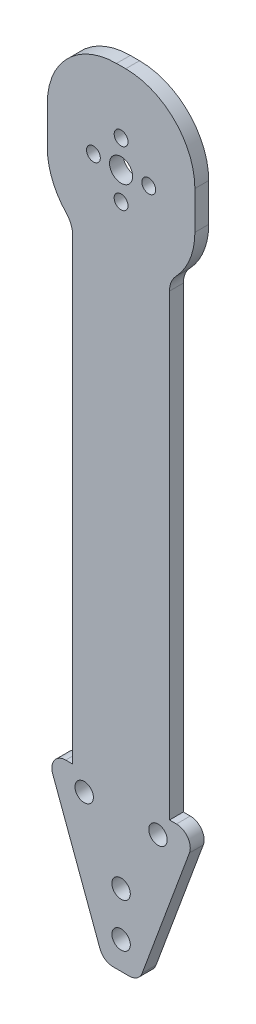
ISO-10303-21;
HEADER;
FILE_DESCRIPTION(('STEP AP214'),'2;1');
FILE_NAME('part.step','',(''),(''),'','','');
FILE_SCHEMA(('AUTOMOTIVE_DESIGN { 1 0 10303 214 1 1 1 1 }'));
ENDSEC;
DATA;
#1=APPLICATION_CONTEXT('core data for automotive mechanical design processes');
#2=APPLICATION_PROTOCOL_DEFINITION('international standard','automotive_design',2000,#1);
#3=PRODUCT_CONTEXT('',#1,'mechanical');
#4=PRODUCT('Part','Part','',(#3));
#5=PRODUCT_RELATED_PRODUCT_CATEGORY('part','',(#4));
#6=PRODUCT_DEFINITION_FORMATION('','',#4);
#7=PRODUCT_DEFINITION_CONTEXT('part definition',#1,'design');
#8=PRODUCT_DEFINITION('design','',#6,#7);
#9=PRODUCT_DEFINITION_SHAPE('','',#8);
#10=(LENGTH_UNIT() NAMED_UNIT(*) SI_UNIT(.MILLI.,.METRE.));
#11=(NAMED_UNIT(*) PLANE_ANGLE_UNIT() SI_UNIT($,.RADIAN.));
#12=(NAMED_UNIT(*) SI_UNIT($,.STERADIAN.) SOLID_ANGLE_UNIT());
#13=UNCERTAINTY_MEASURE_WITH_UNIT(LENGTH_MEASURE(1.E-05),#10,'distance_accuracy_value','');
#14=(GEOMETRIC_REPRESENTATION_CONTEXT(3) GLOBAL_UNCERTAINTY_ASSIGNED_CONTEXT((#13)) GLOBAL_UNIT_ASSIGNED_CONTEXT((#10,
#11,#12)) REPRESENTATION_CONTEXT('',''));
#15=CARTESIAN_POINT('',(0.,0.,0.));
#16=DIRECTION('',(0.,0.,1.));
#17=DIRECTION('',(1.,0.,0.));
#18=AXIS2_PLACEMENT_3D('',#15,#16,#17);
#19=CARTESIAN_POINT('',(15.5,133.,3.));
#20=DIRECTION('',(0.,0.,-1.));
#21=DIRECTION('',(-1.,0.,0.));
#22=AXIS2_PLACEMENT_3D('',#19,#20,#21);
#23=PLANE('',#22);
#24=CARTESIAN_POINT('',(0.,156.5,3.));
#25=DIRECTION('',(0.,0.,-1.));
#26=DIRECTION('',(-1.,0.,0.));
#27=AXIS2_PLACEMENT_3D('',#24,#25,#26);
#28=CIRCLE('',#27,1.5);
#29=CARTESIAN_POINT('',(-1.49999999999994,156.5,3.));
#30=VERTEX_POINT('',#29);
#31=EDGE_CURVE('E1022',#30,#30,#28,.T.);
#32=ORIENTED_EDGE('',*,*,#31,.T.);
#33=EDGE_LOOP('',(#32));
#34=FACE_BOUND('',#33,.T.);
#35=CARTESIAN_POINT('',(6.,150.5,3.));
#36=DIRECTION('',(0.,0.,-1.));
#37=DIRECTION('',(-1.,0.,0.));
#38=AXIS2_PLACEMENT_3D('',#35,#36,#37);
#39=CIRCLE('',#38,1.5);
#40=CARTESIAN_POINT('',(4.5,150.5,3.));
#41=VERTEX_POINT('',#40);
#42=EDGE_CURVE('E773',#41,#41,#39,.T.);
#43=ORIENTED_EDGE('',*,*,#42,.T.);
#44=EDGE_LOOP('',(#43));
#45=FACE_BOUND('',#44,.T.);
#46=DIRECTION('',(-1.,0.,0.));
#47=VECTOR('',#46,1.);
#48=CARTESIAN_POINT('',(12.0022720361968,33.685438564654,3.));
#49=LINE('',#48,#47);
#50=CARTESIAN_POINT('',(12.0022720361968,33.685438564654,3.));
#51=VERTEX_POINT('',#50);
#52=CARTESIAN_POINT('',(10.5,33.685438564654,3.));
#53=VERTEX_POINT('',#52);
#54=EDGE_CURVE('E822',#51,#53,#49,.T.);
#55=ORIENTED_EDGE('',*,*,#54,.T.);
#56=DIRECTION('',(0.,1.,0.));
#57=VECTOR('',#56,1.);
#58=CARTESIAN_POINT('',(10.5,33.685438564654,3.));
#59=LINE('',#58,#57);
#60=CARTESIAN_POINT('',(10.5,133.,3.));
#61=VERTEX_POINT('',#60);
#62=EDGE_CURVE('E694',#53,#61,#59,.T.);
#63=ORIENTED_EDGE('',*,*,#62,.T.);
#64=CARTESIAN_POINT('',(15.5,133.,3.));
#65=DIRECTION('',(0.,0.,-1.));
#66=DIRECTION('',(-1.,0.,0.));
#67=AXIS2_PLACEMENT_3D('',#64,#65,#66);
#68=CIRCLE('',#67,4.99999999999999);
#69=CARTESIAN_POINT('',(11.875,136.443744328489,3.));
#70=VERTEX_POINT('',#69);
#71=EDGE_CURVE('E860',#61,#70,#68,.T.);
#72=ORIENTED_EDGE('',*,*,#71,.T.);
#73=CARTESIAN_POINT('',(1.,146.774977313956,3.));
#74=DIRECTION('',(0.,0.,-1.));
#75=DIRECTION('',(-1.,0.,0.));
#76=AXIS2_PLACEMENT_3D('',#73,#74,#75);
#77=CIRCLE('',#76,15.);
#78=CARTESIAN_POINT('',(16.,146.774977313956,3.));
#79=VERTEX_POINT('',#78);
#80=EDGE_CURVE('E872',#79,#70,#77,.T.);
#81=ORIENTED_EDGE('',*,*,#80,.F.);
#82=DIRECTION('',(0.,1.,0.));
#83=VECTOR('',#82,1.);
#84=CARTESIAN_POINT('',(16.,146.774977313956,3.));
#85=LINE('',#84,#83);
#86=CARTESIAN_POINT('',(16.,155.,3.));
#87=VERTEX_POINT('',#86);
#88=EDGE_CURVE('E873',#79,#87,#85,.T.);
#89=ORIENTED_EDGE('',*,*,#88,.T.);
#90=CARTESIAN_POINT('',(1.,155.,3.));
#91=DIRECTION('',(0.,0.,-1.));
#92=DIRECTION('',(-1.,0.,0.));
#93=AXIS2_PLACEMENT_3D('',#90,#91,#92);
#94=CIRCLE('',#93,15.);
#95=CARTESIAN_POINT('',(0.999999999999895,170.,3.));
#96=VERTEX_POINT('',#95);
#97=EDGE_CURVE('E875',#96,#87,#94,.T.);
#98=ORIENTED_EDGE('',*,*,#97,.F.);
#99=DIRECTION('',(1.,0.,0.));
#100=VECTOR('',#99,1.);
#101=CARTESIAN_POINT('',(-0.999999999999895,170.,3.));
#102=LINE('',#101,#100);
#103=CARTESIAN_POINT('',(-0.999999999999895,170.,3.));
#104=VERTEX_POINT('',#103);
#105=EDGE_CURVE('E882',#104,#96,#102,.T.);
#106=ORIENTED_EDGE('',*,*,#105,.F.);
#107=CARTESIAN_POINT('',(-1.,155.,3.));
#108=DIRECTION('',(0.,0.,-1.));
#109=DIRECTION('',(-1.,0.,0.));
#110=AXIS2_PLACEMENT_3D('',#107,#108,#109);
#111=CIRCLE('',#110,15.);
#112=CARTESIAN_POINT('',(-16.,155.,3.));
#113=VERTEX_POINT('',#112);
#114=EDGE_CURVE('E885',#113,#104,#111,.T.);
#115=ORIENTED_EDGE('',*,*,#114,.F.);
#116=DIRECTION('',(0.,1.,0.));
#117=VECTOR('',#116,1.);
#118=CARTESIAN_POINT('',(-16.,146.774977313956,3.));
#119=LINE('',#118,#117);
#120=CARTESIAN_POINT('',(-16.,146.774977313956,3.));
#121=VERTEX_POINT('',#120);
#122=EDGE_CURVE('E888',#121,#113,#119,.T.);
#123=ORIENTED_EDGE('',*,*,#122,.F.);
#124=CARTESIAN_POINT('',(-1.,146.774977313956,3.));
#125=DIRECTION('',(0.,0.,1.));
#126=DIRECTION('',(1.,0.,0.));
#127=AXIS2_PLACEMENT_3D('',#124,#125,#126);
#128=CIRCLE('',#127,15.);
#129=CARTESIAN_POINT('',(-11.875,136.443744328489,3.));
#130=VERTEX_POINT('',#129);
#131=EDGE_CURVE('E891',#121,#130,#128,.T.);
#132=ORIENTED_EDGE('',*,*,#131,.T.);
#133=CARTESIAN_POINT('',(-15.5,133.,3.));
#134=DIRECTION('',(0.,0.,-1.));
#135=DIRECTION('',(-1.,0.,0.));
#136=AXIS2_PLACEMENT_3D('',#133,#134,#135);
#137=CIRCLE('',#136,5.);
#138=CARTESIAN_POINT('',(-10.5,133.,3.));
#139=VERTEX_POINT('',#138);
#140=EDGE_CURVE('E893',#130,#139,#137,.T.);
#141=ORIENTED_EDGE('',*,*,#140,.T.);
#142=DIRECTION('',(0.,1.,0.));
#143=VECTOR('',#142,1.);
#144=CARTESIAN_POINT('',(-10.5,33.685438564654,3.));
#145=LINE('',#144,#143);
#146=CARTESIAN_POINT('',(-10.5,33.685438564654,3.));
#147=VERTEX_POINT('',#146);
#148=EDGE_CURVE('E895',#147,#139,#145,.T.);
#149=ORIENTED_EDGE('',*,*,#148,.F.);
#150=DIRECTION('',(1.,0.,0.));
#151=VECTOR('',#150,1.);
#152=CARTESIAN_POINT('',(-12.0022720361968,33.685438564654,3.));
#153=LINE('',#152,#151);
#154=CARTESIAN_POINT('',(-12.0022720361968,33.685438564654,3.));
#155=VERTEX_POINT('',#154);
#156=EDGE_CURVE('E898',#155,#147,#153,.T.);
#157=ORIENTED_EDGE('',*,*,#156,.F.);
#158=CARTESIAN_POINT('',(-12.0022720361968,30.685438564654,3.));
#159=DIRECTION('',(0.,0.,-1.));
#160=DIRECTION('',(-1.,0.,0.));
#161=AXIS2_PLACEMENT_3D('',#158,#159,#160);
#162=CIRCLE('',#161,3.);
#163=CARTESIAN_POINT('',(-14.8159863239344,29.6447599846009,3.));
#164=VERTEX_POINT('',#163);
#165=EDGE_CURVE('E901',#164,#155,#162,.T.);
#166=ORIENTED_EDGE('',*,*,#165,.F.);
#167=DIRECTION('',(-0.346892860017721,0.937904762579189,0.));
#168=VECTOR('',#167,1.);
#169=CARTESIAN_POINT('',(-4.57626759372177,1.95932141994684,3.));
#170=LINE('',#169,#168);
#171=CARTESIAN_POINT('',(-4.57626759372177,1.95932141994684,3.));
#172=VERTEX_POINT('',#171);
#173=EDGE_CURVE('E904',#172,#164,#170,.T.);
#174=ORIENTED_EDGE('',*,*,#173,.F.);
#175=CARTESIAN_POINT('',(-1.7625533059842,3.,3.));
#176=DIRECTION('',(0.,0.,1.));
#177=DIRECTION('',(1.,0.,0.));
#178=AXIS2_PLACEMENT_3D('',#175,#176,#177);
#179=CIRCLE('',#178,3.);
#180=CARTESIAN_POINT('',(-1.7625533059842,0.,3.));
#181=VERTEX_POINT('',#180);
#182=EDGE_CURVE('E763',#172,#181,#179,.T.);
#183=ORIENTED_EDGE('',*,*,#182,.T.);
#184=DIRECTION('',(-1.,0.,0.));
#185=VECTOR('',#184,1.);
#186=CARTESIAN_POINT('',(1.7625533059842,0.,3.));
#187=LINE('',#186,#185);
#188=CARTESIAN_POINT('',(1.7625533059842,0.,3.));
#189=VERTEX_POINT('',#188);
#190=EDGE_CURVE('E761',#189,#181,#187,.T.);
#191=ORIENTED_EDGE('',*,*,#190,.F.);
#192=CARTESIAN_POINT('',(1.7625533059842,3.,3.));
#193=DIRECTION('',(0.,0.,-1.));
#194=DIRECTION('',(-1.,0.,0.));
#195=AXIS2_PLACEMENT_3D('',#192,#193,#194);
#196=CIRCLE('',#195,3.);
#197=CARTESIAN_POINT('',(4.57626759372177,1.95932141994684,3.));
#198=VERTEX_POINT('',#197);
#199=EDGE_CURVE('E749',#198,#189,#196,.T.);
#200=ORIENTED_EDGE('',*,*,#199,.F.);
#201=DIRECTION('',(0.346892860017721,0.937904762579189,0.));
#202=VECTOR('',#201,1.);
#203=CARTESIAN_POINT('',(4.57626759372177,1.95932141994684,3.));
#204=LINE('',#203,#202);
#205=CARTESIAN_POINT('',(14.8159863239344,29.6447599846009,3.));
#206=VERTEX_POINT('',#205);
#207=EDGE_CURVE('E755',#198,#206,#204,.T.);
#208=ORIENTED_EDGE('',*,*,#207,.T.);
#209=CARTESIAN_POINT('',(12.0022720361968,30.685438564654,3.));
#210=DIRECTION('',(0.,0.,1.));
#211=DIRECTION('',(1.,0.,0.));
#212=AXIS2_PLACEMENT_3D('',#209,#210,#211);
#213=CIRCLE('',#212,3.);
#214=EDGE_CURVE('E616',#206,#51,#213,.T.);
#215=ORIENTED_EDGE('',*,*,#214,.T.);
#216=EDGE_LOOP('',(#55,#63,#72,#81,#89,#98,#106,#115,#123,#132,#141,#149,#157,#166,#174,#183,
#191,#200,#208,#215));
#217=FACE_BOUND('',#216,.T.);
#218=CARTESIAN_POINT('',(-6.,150.5,3.));
#219=DIRECTION('',(0.,0.,1.));
#220=DIRECTION('',(1.,0.,0.));
#221=AXIS2_PLACEMENT_3D('',#218,#219,#220);
#222=CIRCLE('',#221,1.5);
#223=CARTESIAN_POINT('',(-4.5,150.5,3.));
#224=VERTEX_POINT('',#223);
#225=EDGE_CURVE('E1016',#224,#224,#222,.T.);
#226=ORIENTED_EDGE('',*,*,#225,.F.);
#227=EDGE_LOOP('',(#226));
#228=FACE_BOUND('',#227,.T.);
#229=CARTESIAN_POINT('',(0.,144.5,3.));
#230=DIRECTION('',(0.,0.,1.));
#231=DIRECTION('',(1.,0.,0.));
#232=AXIS2_PLACEMENT_3D('',#229,#230,#231);
#233=CIRCLE('',#232,1.5);
#234=CARTESIAN_POINT('',(1.5,144.5,3.));
#235=VERTEX_POINT('',#234);
#236=EDGE_CURVE('E1010',#235,#235,#233,.T.);
#237=ORIENTED_EDGE('',*,*,#236,.F.);
#238=EDGE_LOOP('',(#237));
#239=FACE_BOUND('',#238,.T.);
#240=CARTESIAN_POINT('',(0.,6.,3.));
#241=DIRECTION('',(0.,0.,1.));
#242=DIRECTION('',(1.,0.,0.));
#243=AXIS2_PLACEMENT_3D('',#240,#241,#242);
#244=CIRCLE('',#243,2.);
#245=CARTESIAN_POINT('',(2.,6.,3.));
#246=VERTEX_POINT('',#245);
#247=EDGE_CURVE('E1004',#246,#246,#244,.T.);
#248=ORIENTED_EDGE('',*,*,#247,.F.);
#249=EDGE_LOOP('',(#248));
#250=FACE_BOUND('',#249,.T.);
#251=CARTESIAN_POINT('',(0.,15.55,3.));
#252=DIRECTION('',(0.,0.,1.));
#253=DIRECTION('',(1.,0.,0.));
#254=AXIS2_PLACEMENT_3D('',#251,#252,#253);
#255=CIRCLE('',#254,2.);
#256=CARTESIAN_POINT('',(2.,15.55,3.));
#257=VERTEX_POINT('',#256);
#258=EDGE_CURVE('E998',#257,#257,#255,.T.);
#259=ORIENTED_EDGE('',*,*,#258,.F.);
#260=EDGE_LOOP('',(#259));
#261=FACE_BOUND('',#260,.T.);
#262=CARTESIAN_POINT('',(-8.00000000000001,29.685438564654,3.));
#263=DIRECTION('',(0.,0.,1.));
#264=DIRECTION('',(1.,0.,0.));
#265=AXIS2_PLACEMENT_3D('',#262,#263,#264);
#266=CIRCLE('',#265,2.);
#267=CARTESIAN_POINT('',(-6.,29.685438564654,3.));
#268=VERTEX_POINT('',#267);
#269=EDGE_CURVE('E992',#268,#268,#266,.T.);
#270=ORIENTED_EDGE('',*,*,#269,.F.);
#271=EDGE_LOOP('',(#270));
#272=FACE_BOUND('',#271,.T.);
#273=CARTESIAN_POINT('',(7.99999999999999,29.685438564654,3.));
#274=DIRECTION('',(0.,0.,1.));
#275=DIRECTION('',(1.,0.,0.));
#276=AXIS2_PLACEMENT_3D('',#273,#274,#275);
#277=CIRCLE('',#276,2.);
#278=CARTESIAN_POINT('',(9.99999999999999,29.685438564654,3.));
#279=VERTEX_POINT('',#278);
#280=EDGE_CURVE('E986',#279,#279,#277,.T.);
#281=ORIENTED_EDGE('',*,*,#280,.F.);
#282=EDGE_LOOP('',(#281));
#283=FACE_BOUND('',#282,.T.);
#284=CARTESIAN_POINT('',(0.,150.5,3.));
#285=DIRECTION('',(0.,0.,1.));
#286=DIRECTION('',(1.,0.,0.));
#287=AXIS2_PLACEMENT_3D('',#284,#285,#286);
#288=CIRCLE('',#287,2.5);
#289=CARTESIAN_POINT('',(2.5,150.5,3.));
#290=VERTEX_POINT('',#289);
#291=EDGE_CURVE('E977',#290,#290,#288,.T.);
#292=ORIENTED_EDGE('',*,*,#291,.F.);
#293=EDGE_LOOP('',(#292));
#294=FACE_BOUND('',#293,.T.);
#295=ADVANCED_FACE('F599',(#34,#45,#217,#228,#239,#250,#261,#272,#283,#294),#23,.F.);
#296=CARTESIAN_POINT('',(15.5,133.,0.));
#297=DIRECTION('',(0.,0.,-1.));
#298=DIRECTION('',(-1.,0.,0.));
#299=AXIS2_PLACEMENT_3D('',#296,#297,#298);
#300=PLANE('',#299);
#301=CARTESIAN_POINT('',(7.99999999999999,29.685438564654,0.));
#302=DIRECTION('',(0.,0.,1.));
#303=DIRECTION('',(1.,0.,0.));
#304=AXIS2_PLACEMENT_3D('',#301,#302,#303);
#305=CIRCLE('',#304,2.);
#306=CARTESIAN_POINT('',(9.99999999999999,29.685438564654,0.));
#307=VERTEX_POINT('',#306);
#308=EDGE_CURVE('E983',#307,#307,#305,.T.);
#309=ORIENTED_EDGE('',*,*,#308,.T.);
#310=EDGE_LOOP('',(#309));
#311=FACE_BOUND('',#310,.T.);
#312=CARTESIAN_POINT('',(0.,15.55,0.));
#313=DIRECTION('',(0.,0.,1.));
#314=DIRECTION('',(1.,0.,0.));
#315=AXIS2_PLACEMENT_3D('',#312,#313,#314);
#316=CIRCLE('',#315,2.);
#317=CARTESIAN_POINT('',(2.,15.55,0.));
#318=VERTEX_POINT('',#317);
#319=EDGE_CURVE('E995',#318,#318,#316,.T.);
#320=ORIENTED_EDGE('',*,*,#319,.T.);
#321=EDGE_LOOP('',(#320));
#322=FACE_BOUND('',#321,.T.);
#323=CARTESIAN_POINT('',(0.,144.5,0.));
#324=DIRECTION('',(0.,0.,1.));
#325=DIRECTION('',(1.,0.,0.));
#326=AXIS2_PLACEMENT_3D('',#323,#324,#325);
#327=CIRCLE('',#326,1.5);
#328=CARTESIAN_POINT('',(1.5,144.5,0.));
#329=VERTEX_POINT('',#328);
#330=EDGE_CURVE('E1007',#329,#329,#327,.T.);
#331=ORIENTED_EDGE('',*,*,#330,.T.);
#332=EDGE_LOOP('',(#331));
#333=FACE_BOUND('',#332,.T.);
#334=DIRECTION('',(-1.,0.,0.));
#335=VECTOR('',#334,1.);
#336=CARTESIAN_POINT('',(12.0022720361968,33.685438564654,0.));
#337=LINE('',#336,#335);
#338=CARTESIAN_POINT('',(12.0022720361968,33.685438564654,0.));
#339=VERTEX_POINT('',#338);
#340=CARTESIAN_POINT('',(10.5,33.685438564654,0.));
#341=VERTEX_POINT('',#340);
#342=EDGE_CURVE('E769',#339,#341,#337,.T.);
#343=ORIENTED_EDGE('',*,*,#342,.F.);
#344=CARTESIAN_POINT('',(12.0022720361968,30.685438564654,0.));
#345=DIRECTION('',(0.,0.,1.));
#346=DIRECTION('',(1.,0.,0.));
#347=AXIS2_PLACEMENT_3D('',#344,#345,#346);
#348=CIRCLE('',#347,3.);
#349=CARTESIAN_POINT('',(14.8159863239344,29.6447599846009,0.));
#350=VERTEX_POINT('',#349);
#351=EDGE_CURVE('E686',#350,#339,#348,.T.);
#352=ORIENTED_EDGE('',*,*,#351,.F.);
#353=DIRECTION('',(0.346892860017721,0.937904762579189,0.));
#354=VECTOR('',#353,1.);
#355=CARTESIAN_POINT('',(4.57626759372177,1.95932141994684,0.));
#356=LINE('',#355,#354);
#357=CARTESIAN_POINT('',(4.57626759372177,1.95932141994684,0.));
#358=VERTEX_POINT('',#357);
#359=EDGE_CURVE('E680',#358,#350,#356,.T.);
#360=ORIENTED_EDGE('',*,*,#359,.F.);
#361=CARTESIAN_POINT('',(1.7625533059842,3.,0.));
#362=DIRECTION('',(0.,0.,-1.));
#363=DIRECTION('',(-1.,0.,0.));
#364=AXIS2_PLACEMENT_3D('',#361,#362,#363);
#365=CIRCLE('',#364,3.);
#366=CARTESIAN_POINT('',(1.7625533059842,0.,0.));
#367=VERTEX_POINT('',#366);
#368=EDGE_CURVE('E751',#358,#367,#365,.T.);
#369=ORIENTED_EDGE('',*,*,#368,.T.);
#370=DIRECTION('',(-1.,0.,0.));
#371=VECTOR('',#370,1.);
#372=CARTESIAN_POINT('',(1.7625533059842,0.,0.));
#373=LINE('',#372,#371);
#374=CARTESIAN_POINT('',(-1.7625533059842,0.,0.));
#375=VERTEX_POINT('',#374);
#376=EDGE_CURVE('E816',#367,#375,#373,.T.);
#377=ORIENTED_EDGE('',*,*,#376,.T.);
#378=CARTESIAN_POINT('',(-1.7625533059842,3.,0.));
#379=DIRECTION('',(0.,0.,1.));
#380=DIRECTION('',(1.,0.,0.));
#381=AXIS2_PLACEMENT_3D('',#378,#379,#380);
#382=CIRCLE('',#381,3.);
#383=CARTESIAN_POINT('',(-4.57626759372177,1.95932141994684,0.));
#384=VERTEX_POINT('',#383);
#385=EDGE_CURVE('E813',#384,#375,#382,.T.);
#386=ORIENTED_EDGE('',*,*,#385,.F.);
#387=DIRECTION('',(-0.346892860017721,0.937904762579189,0.));
#388=VECTOR('',#387,1.);
#389=CARTESIAN_POINT('',(-4.57626759372177,1.95932141994684,0.));
#390=LINE('',#389,#388);
#391=CARTESIAN_POINT('',(-14.8159863239344,29.6447599846009,0.));
#392=VERTEX_POINT('',#391);
#393=EDGE_CURVE('E810',#384,#392,#390,.T.);
#394=ORIENTED_EDGE('',*,*,#393,.T.);
#395=CARTESIAN_POINT('',(-12.0022720361968,30.685438564654,0.));
#396=DIRECTION('',(0.,0.,-1.));
#397=DIRECTION('',(-1.,0.,0.));
#398=AXIS2_PLACEMENT_3D('',#395,#396,#397);
#399=CIRCLE('',#398,3.);
#400=CARTESIAN_POINT('',(-12.0022720361968,33.685438564654,0.));
#401=VERTEX_POINT('',#400);
#402=EDGE_CURVE('E807',#392,#401,#399,.T.);
#403=ORIENTED_EDGE('',*,*,#402,.T.);
#404=DIRECTION('',(1.,0.,0.));
#405=VECTOR('',#404,1.);
#406=CARTESIAN_POINT('',(-12.0022720361968,33.685438564654,0.));
#407=LINE('',#406,#405);
#408=CARTESIAN_POINT('',(-10.5,33.685438564654,0.));
#409=VERTEX_POINT('',#408);
#410=EDGE_CURVE('E804',#401,#409,#407,.T.);
#411=ORIENTED_EDGE('',*,*,#410,.T.);
#412=DIRECTION('',(0.,1.,0.));
#413=VECTOR('',#412,1.);
#414=CARTESIAN_POINT('',(-10.5,33.685438564654,0.));
#415=LINE('',#414,#413);
#416=CARTESIAN_POINT('',(-10.5,133.,0.));
#417=VERTEX_POINT('',#416);
#418=EDGE_CURVE('E801',#409,#417,#415,.T.);
#419=ORIENTED_EDGE('',*,*,#418,.T.);
#420=CARTESIAN_POINT('',(-15.5,133.,0.));
#421=DIRECTION('',(0.,0.,-1.));
#422=DIRECTION('',(-1.,0.,0.));
#423=AXIS2_PLACEMENT_3D('',#420,#421,#422);
#424=CIRCLE('',#423,5.);
#425=CARTESIAN_POINT('',(-11.875,136.443744328489,0.));
#426=VERTEX_POINT('',#425);
#427=EDGE_CURVE('E798',#426,#417,#424,.T.);
#428=ORIENTED_EDGE('',*,*,#427,.F.);
#429=CARTESIAN_POINT('',(-1.,146.774977313956,0.));
#430=DIRECTION('',(0.,0.,1.));
#431=DIRECTION('',(1.,0.,0.));
#432=AXIS2_PLACEMENT_3D('',#429,#430,#431);
#433=CIRCLE('',#432,15.);
#434=CARTESIAN_POINT('',(-16.,146.774977313956,0.));
#435=VERTEX_POINT('',#434);
#436=EDGE_CURVE('E796',#435,#426,#433,.T.);
#437=ORIENTED_EDGE('',*,*,#436,.F.);
#438=DIRECTION('',(0.,1.,0.));
#439=VECTOR('',#438,1.);
#440=CARTESIAN_POINT('',(-16.,146.774977313956,0.));
#441=LINE('',#440,#439);
#442=CARTESIAN_POINT('',(-16.,155.,0.));
#443=VERTEX_POINT('',#442);
#444=EDGE_CURVE('E793',#435,#443,#441,.T.);
#445=ORIENTED_EDGE('',*,*,#444,.T.);
#446=CARTESIAN_POINT('',(-1.,155.,0.));
#447=DIRECTION('',(0.,0.,-1.));
#448=DIRECTION('',(-1.,0.,0.));
#449=AXIS2_PLACEMENT_3D('',#446,#447,#448);
#450=CIRCLE('',#449,15.);
#451=CARTESIAN_POINT('',(-0.999999999999895,170.,0.));
#452=VERTEX_POINT('',#451);
#453=EDGE_CURVE('E790',#443,#452,#450,.T.);
#454=ORIENTED_EDGE('',*,*,#453,.T.);
#455=DIRECTION('',(1.,0.,0.));
#456=VECTOR('',#455,1.);
#457=CARTESIAN_POINT('',(-0.999999999999895,170.,0.));
#458=LINE('',#457,#456);
#459=CARTESIAN_POINT('',(0.999999999999895,170.,0.));
#460=VERTEX_POINT('',#459);
#461=EDGE_CURVE('E787',#452,#460,#458,.T.);
#462=ORIENTED_EDGE('',*,*,#461,.T.);
#463=CARTESIAN_POINT('',(1.,155.,0.));
#464=DIRECTION('',(0.,0.,-1.));
#465=DIRECTION('',(-1.,0.,0.));
#466=AXIS2_PLACEMENT_3D('',#463,#464,#465);
#467=CIRCLE('',#466,15.);
#468=CARTESIAN_POINT('',(16.,155.,0.));
#469=VERTEX_POINT('',#468);
#470=EDGE_CURVE('E784',#460,#469,#467,.T.);
#471=ORIENTED_EDGE('',*,*,#470,.T.);
#472=DIRECTION('',(0.,1.,0.));
#473=VECTOR('',#472,1.);
#474=CARTESIAN_POINT('',(16.,146.774977313956,0.));
#475=LINE('',#474,#473);
#476=CARTESIAN_POINT('',(16.,146.774977313956,0.));
#477=VERTEX_POINT('',#476);
#478=EDGE_CURVE('E781',#477,#469,#475,.T.);
#479=ORIENTED_EDGE('',*,*,#478,.F.);
#480=CARTESIAN_POINT('',(1.,146.774977313956,0.));
#481=DIRECTION('',(0.,0.,-1.));
#482=DIRECTION('',(-1.,0.,0.));
#483=AXIS2_PLACEMENT_3D('',#480,#481,#482);
#484=CIRCLE('',#483,15.);
#485=CARTESIAN_POINT('',(11.875,136.443744328489,0.));
#486=VERTEX_POINT('',#485);
#487=EDGE_CURVE('E778',#477,#486,#484,.T.);
#488=ORIENTED_EDGE('',*,*,#487,.T.);
#489=CARTESIAN_POINT('',(15.5,133.,0.));
#490=DIRECTION('',(0.,0.,-1.));
#491=DIRECTION('',(-1.,0.,0.));
#492=AXIS2_PLACEMENT_3D('',#489,#490,#491);
#493=CIRCLE('',#492,4.99999999999999);
#494=CARTESIAN_POINT('',(10.5,133.,0.));
#495=VERTEX_POINT('',#494);
#496=EDGE_CURVE('E775',#495,#486,#493,.T.);
#497=ORIENTED_EDGE('',*,*,#496,.F.);
#498=DIRECTION('',(0.,1.,0.));
#499=VECTOR('',#498,1.);
#500=CARTESIAN_POINT('',(10.5,33.685438564654,0.));
#501=LINE('',#500,#499);
#502=EDGE_CURVE('E772',#341,#495,#501,.T.);
#503=ORIENTED_EDGE('',*,*,#502,.F.);
#504=EDGE_LOOP('',(#343,#352,#360,#369,#377,#386,#394,#403,#411,#419,#428,#437,#445,#454,#462,
#471,#479,#488,#497,#503));
#505=FACE_BOUND('',#504,.T.);
#506=CARTESIAN_POINT('',(6.,150.5,0.));
#507=DIRECTION('',(0.,0.,-1.));
#508=DIRECTION('',(-1.,0.,0.));
#509=AXIS2_PLACEMENT_3D('',#506,#507,#508);
#510=CIRCLE('',#509,1.5);
#511=CARTESIAN_POINT('',(4.5,150.5,0.));
#512=VERTEX_POINT('',#511);
#513=EDGE_CURVE('E1024',#512,#512,#510,.T.);
#514=ORIENTED_EDGE('',*,*,#513,.F.);
#515=EDGE_LOOP('',(#514));
#516=FACE_BOUND('',#515,.T.);
#517=CARTESIAN_POINT('',(0.,156.5,0.));
#518=DIRECTION('',(0.,0.,-1.));
#519=DIRECTION('',(-1.,0.,0.));
#520=AXIS2_PLACEMENT_3D('',#517,#518,#519);
#521=CIRCLE('',#520,1.5);
#522=CARTESIAN_POINT('',(-1.49999999999994,156.5,0.));
#523=VERTEX_POINT('',#522);
#524=EDGE_CURVE('E1019',#523,#523,#521,.T.);
#525=ORIENTED_EDGE('',*,*,#524,.F.);
#526=EDGE_LOOP('',(#525));
#527=FACE_BOUND('',#526,.T.);
#528=CARTESIAN_POINT('',(-6.,150.5,0.));
#529=DIRECTION('',(0.,0.,1.));
#530=DIRECTION('',(1.,0.,0.));
#531=AXIS2_PLACEMENT_3D('',#528,#529,#530);
#532=CIRCLE('',#531,1.5);
#533=CARTESIAN_POINT('',(-4.5,150.5,0.));
#534=VERTEX_POINT('',#533);
#535=EDGE_CURVE('E1013',#534,#534,#532,.T.);
#536=ORIENTED_EDGE('',*,*,#535,.T.);
#537=EDGE_LOOP('',(#536));
#538=FACE_BOUND('',#537,.T.);
#539=CARTESIAN_POINT('',(0.,6.,0.));
#540=DIRECTION('',(0.,0.,1.));
#541=DIRECTION('',(1.,0.,0.));
#542=AXIS2_PLACEMENT_3D('',#539,#540,#541);
#543=CIRCLE('',#542,2.);
#544=CARTESIAN_POINT('',(2.,6.,0.));
#545=VERTEX_POINT('',#544);
#546=EDGE_CURVE('E1001',#545,#545,#543,.T.);
#547=ORIENTED_EDGE('',*,*,#546,.T.);
#548=EDGE_LOOP('',(#547));
#549=FACE_BOUND('',#548,.T.);
#550=CARTESIAN_POINT('',(-8.00000000000001,29.685438564654,0.));
#551=DIRECTION('',(0.,0.,1.));
#552=DIRECTION('',(1.,0.,0.));
#553=AXIS2_PLACEMENT_3D('',#550,#551,#552);
#554=CIRCLE('',#553,2.);
#555=CARTESIAN_POINT('',(-6.,29.685438564654,0.));
#556=VERTEX_POINT('',#555);
#557=EDGE_CURVE('E989',#556,#556,#554,.T.);
#558=ORIENTED_EDGE('',*,*,#557,.T.);
#559=EDGE_LOOP('',(#558));
#560=FACE_BOUND('',#559,.T.);
#561=CARTESIAN_POINT('',(0.,150.5,0.));
#562=DIRECTION('',(0.,0.,1.));
#563=DIRECTION('',(1.,0.,0.));
#564=AXIS2_PLACEMENT_3D('',#561,#562,#563);
#565=CIRCLE('',#564,2.5);
#566=CARTESIAN_POINT('',(2.5,150.5,0.));
#567=VERTEX_POINT('',#566);
#568=EDGE_CURVE('E980',#567,#567,#565,.T.);
#569=ORIENTED_EDGE('',*,*,#568,.T.);
#570=EDGE_LOOP('',(#569));
#571=FACE_BOUND('',#570,.T.);
#572=ADVANCED_FACE('F863',(#311,#322,#333,#505,#516,#527,#538,#549,#560,#571),#300,.T.);
#573=CARTESIAN_POINT('',(12.0022720361968,33.685438564654,3.));
#574=DIRECTION('',(0.,-1.,0.));
#575=DIRECTION('',(0.,0.,-1.));
#576=AXIS2_PLACEMENT_3D('',#573,#574,#575);
#577=PLANE('',#576);
#578=ORIENTED_EDGE('',*,*,#342,.T.);
#579=DIRECTION('',(0.,0.,-1.));
#580=VECTOR('',#579,1.);
#581=CARTESIAN_POINT('',(10.5,33.685438564654,3.));
#582=LINE('',#581,#580);
#583=EDGE_CURVE('E12',#53,#341,#582,.T.);
#584=ORIENTED_EDGE('',*,*,#583,.F.);
#585=ORIENTED_EDGE('',*,*,#54,.F.);
#586=DIRECTION('',(0.,0.,-1.));
#587=VECTOR('',#586,1.);
#588=CARTESIAN_POINT('',(12.0022720361968,33.685438564654,3.));
#589=LINE('',#588,#587);
#590=EDGE_CURVE('E768',#51,#339,#589,.T.);
#591=ORIENTED_EDGE('',*,*,#590,.T.);
#592=EDGE_LOOP('',(#578,#584,#585,#591));
#593=FACE_BOUND('',#592,.T.);
#594=ADVANCED_FACE('F601',(#593),#577,.F.);
#595=CARTESIAN_POINT('',(10.5,33.685438564654,3.));
#596=DIRECTION('',(-1.,0.,0.));
#597=DIRECTION('',(0.,-1.,0.));
#598=AXIS2_PLACEMENT_3D('',#595,#596,#597);
#599=PLANE('',#598);
#600=ORIENTED_EDGE('',*,*,#502,.T.);
#601=DIRECTION('',(0.,0.,-1.));
#602=VECTOR('',#601,1.);
#603=CARTESIAN_POINT('',(10.5,133.,3.));
#604=LINE('',#603,#602);
#605=EDGE_CURVE('E608',#61,#495,#604,.T.);
#606=ORIENTED_EDGE('',*,*,#605,.F.);
#607=ORIENTED_EDGE('',*,*,#62,.F.);
#608=ORIENTED_EDGE('',*,*,#583,.T.);
#609=EDGE_LOOP('',(#600,#606,#607,#608));
#610=FACE_BOUND('',#609,.T.);
#611=ADVANCED_FACE('F1260',(#610),#599,.F.);
#612=CARTESIAN_POINT('',(15.5,133.,3.));
#613=DIRECTION('',(0.,0.,-1.));
#614=DIRECTION('',(-1.,0.,0.));
#615=AXIS2_PLACEMENT_3D('',#612,#613,#614);
#616=CYLINDRICAL_SURFACE('',#615,4.99999999999999);
#617=ORIENTED_EDGE('',*,*,#496,.T.);
#618=DIRECTION('',(0.,0.,-1.));
#619=VECTOR('',#618,1.);
#620=CARTESIAN_POINT('',(11.875,136.443744328489,3.));
#621=LINE('',#620,#619);
#622=EDGE_CURVE('E853',#70,#486,#621,.T.);
#623=ORIENTED_EDGE('',*,*,#622,.F.);
#624=ORIENTED_EDGE('',*,*,#71,.F.);
#625=ORIENTED_EDGE('',*,*,#605,.T.);
#626=EDGE_LOOP('',(#617,#623,#624,#625));
#627=FACE_BOUND('',#626,.T.);
#628=ADVANCED_FACE('F858',(#627),#616,.F.);
#629=CARTESIAN_POINT('',(1.,146.774977313956,3.));
#630=DIRECTION('',(0.,0.,-1.));
#631=DIRECTION('',(-1.,0.,0.));
#632=AXIS2_PLACEMENT_3D('',#629,#630,#631);
#633=CYLINDRICAL_SURFACE('',#632,15.);
#634=ORIENTED_EDGE('',*,*,#487,.F.);
#635=DIRECTION('',(0.,0.,-1.));
#636=VECTOR('',#635,1.);
#637=CARTESIAN_POINT('',(16.,146.774977313956,3.));
#638=LINE('',#637,#636);
#639=EDGE_CURVE('E851',#79,#477,#638,.T.);
#640=ORIENTED_EDGE('',*,*,#639,.F.);
#641=ORIENTED_EDGE('',*,*,#80,.T.);
#642=ORIENTED_EDGE('',*,*,#622,.T.);
#643=EDGE_LOOP('',(#634,#640,#641,#642));
#644=FACE_BOUND('',#643,.T.);
#645=ADVANCED_FACE('F868',(#644),#633,.T.);
#646=CARTESIAN_POINT('',(16.,146.774977313956,3.));
#647=DIRECTION('',(-1.,0.,0.));
#648=DIRECTION('',(0.,0.,1.));
#649=AXIS2_PLACEMENT_3D('',#646,#647,#648);
#650=PLANE('',#649);
#651=ORIENTED_EDGE('',*,*,#478,.T.);
#652=DIRECTION('',(0.,0.,-1.));
#653=VECTOR('',#652,1.);
#654=CARTESIAN_POINT('',(16.,155.,3.));
#655=LINE('',#654,#653);
#656=EDGE_CURVE('E849',#87,#469,#655,.T.);
#657=ORIENTED_EDGE('',*,*,#656,.F.);
#658=ORIENTED_EDGE('',*,*,#88,.F.);
#659=ORIENTED_EDGE('',*,*,#639,.T.);
#660=EDGE_LOOP('',(#651,#657,#658,#659));
#661=FACE_BOUND('',#660,.T.);
#662=ADVANCED_FACE('F1233',(#661),#650,.F.);
#663=CARTESIAN_POINT('',(1.,155.,3.));
#664=DIRECTION('',(0.,0.,-1.));
#665=DIRECTION('',(-1.,0.,0.));
#666=AXIS2_PLACEMENT_3D('',#663,#664,#665);
#667=CYLINDRICAL_SURFACE('',#666,15.);
#668=ORIENTED_EDGE('',*,*,#470,.F.);
#669=DIRECTION('',(0.,0.,-1.));
#670=VECTOR('',#669,1.);
#671=CARTESIAN_POINT('',(0.999999999999895,170.,3.));
#672=LINE('',#671,#670);
#673=EDGE_CURVE('E847',#96,#460,#672,.T.);
#674=ORIENTED_EDGE('',*,*,#673,.F.);
#675=ORIENTED_EDGE('',*,*,#97,.T.);
#676=ORIENTED_EDGE('',*,*,#656,.T.);
#677=EDGE_LOOP('',(#668,#674,#675,#676));
#678=FACE_BOUND('',#677,.T.);
#679=ADVANCED_FACE('F1223',(#678),#667,.T.);
#680=CARTESIAN_POINT('',(-0.999999999999895,170.,3.));
#681=DIRECTION('',(0.,1.,0.));
#682=DIRECTION('',(0.,0.,1.));
#683=AXIS2_PLACEMENT_3D('',#680,#681,#682);
#684=PLANE('',#683);
#685=ORIENTED_EDGE('',*,*,#461,.F.);
#686=DIRECTION('',(0.,0.,-1.));
#687=VECTOR('',#686,1.);
#688=CARTESIAN_POINT('',(-0.999999999999895,170.,3.));
#689=LINE('',#688,#687);
#690=EDGE_CURVE('E845',#104,#452,#689,.T.);
#691=ORIENTED_EDGE('',*,*,#690,.F.);
#692=ORIENTED_EDGE('',*,*,#105,.T.);
#693=ORIENTED_EDGE('',*,*,#673,.T.);
#694=EDGE_LOOP('',(#685,#691,#692,#693));
#695=FACE_BOUND('',#694,.T.);
#696=ADVANCED_FACE('F1213',(#695),#684,.T.);
#697=CARTESIAN_POINT('',(-1.,155.,3.));
#698=DIRECTION('',(0.,0.,-1.));
#699=DIRECTION('',(-1.,0.,0.));
#700=AXIS2_PLACEMENT_3D('',#697,#698,#699);
#701=CYLINDRICAL_SURFACE('',#700,15.);
#702=ORIENTED_EDGE('',*,*,#453,.F.);
#703=DIRECTION('',(0.,0.,-1.));
#704=VECTOR('',#703,1.);
#705=CARTESIAN_POINT('',(-16.,155.,3.));
#706=LINE('',#705,#704);
#707=EDGE_CURVE('E843',#113,#443,#706,.T.);
#708=ORIENTED_EDGE('',*,*,#707,.F.);
#709=ORIENTED_EDGE('',*,*,#114,.T.);
#710=ORIENTED_EDGE('',*,*,#690,.T.);
#711=EDGE_LOOP('',(#702,#708,#709,#710));
#712=FACE_BOUND('',#711,.T.);
#713=ADVANCED_FACE('F1203',(#712),#701,.T.);
#714=CARTESIAN_POINT('',(-16.,146.774977313956,3.));
#715=DIRECTION('',(-1.,0.,0.));
#716=DIRECTION('',(0.,0.,1.));
#717=AXIS2_PLACEMENT_3D('',#714,#715,#716);
#718=PLANE('',#717);
#719=ORIENTED_EDGE('',*,*,#444,.F.);
#720=DIRECTION('',(0.,0.,-1.));
#721=VECTOR('',#720,1.);
#722=CARTESIAN_POINT('',(-16.,146.774977313956,3.));
#723=LINE('',#722,#721);
#724=EDGE_CURVE('E841',#121,#435,#723,.T.);
#725=ORIENTED_EDGE('',*,*,#724,.F.);
#726=ORIENTED_EDGE('',*,*,#122,.T.);
#727=ORIENTED_EDGE('',*,*,#707,.T.);
#728=EDGE_LOOP('',(#719,#725,#726,#727));
#729=FACE_BOUND('',#728,.T.);
#730=ADVANCED_FACE('F1193',(#729),#718,.T.);
#731=CARTESIAN_POINT('',(-1.,146.774977313956,3.));
#732=DIRECTION('',(0.,0.,-1.));
#733=DIRECTION('',(-1.,0.,0.));
#734=AXIS2_PLACEMENT_3D('',#731,#732,#733);
#735=CYLINDRICAL_SURFACE('',#734,15.);
#736=ORIENTED_EDGE('',*,*,#436,.T.);
#737=DIRECTION('',(0.,0.,-1.));
#738=VECTOR('',#737,1.);
#739=CARTESIAN_POINT('',(-11.875,136.443744328489,3.));
#740=LINE('',#739,#738);
#741=EDGE_CURVE('E838',#130,#426,#740,.T.);
#742=ORIENTED_EDGE('',*,*,#741,.F.);
#743=ORIENTED_EDGE('',*,*,#131,.F.);
#744=ORIENTED_EDGE('',*,*,#724,.T.);
#745=EDGE_LOOP('',(#736,#742,#743,#744));
#746=FACE_BOUND('',#745,.T.);
#747=ADVANCED_FACE('F1183',(#746),#735,.T.);
#748=CARTESIAN_POINT('',(-15.5,133.,3.));
#749=DIRECTION('',(0.,0.,-1.));
#750=DIRECTION('',(-1.,0.,0.));
#751=AXIS2_PLACEMENT_3D('',#748,#749,#750);
#752=CYLINDRICAL_SURFACE('',#751,5.);
#753=ORIENTED_EDGE('',*,*,#427,.T.);
#754=DIRECTION('',(0.,0.,-1.));
#755=VECTOR('',#754,1.);
#756=CARTESIAN_POINT('',(-10.5,133.,3.));
#757=LINE('',#756,#755);
#758=EDGE_CURVE('E836',#139,#417,#757,.T.);
#759=ORIENTED_EDGE('',*,*,#758,.F.);
#760=ORIENTED_EDGE('',*,*,#140,.F.);
#761=ORIENTED_EDGE('',*,*,#741,.T.);
#762=EDGE_LOOP('',(#753,#759,#760,#761));
#763=FACE_BOUND('',#762,.T.);
#764=ADVANCED_FACE('F1173',(#763),#752,.F.);
#765=CARTESIAN_POINT('',(-10.5,33.685438564654,3.));
#766=DIRECTION('',(-1.,0.,0.));
#767=DIRECTION('',(0.,-1.,0.));
#768=AXIS2_PLACEMENT_3D('',#765,#766,#767);
#769=PLANE('',#768);
#770=ORIENTED_EDGE('',*,*,#418,.F.);
#771=DIRECTION('',(0.,0.,-1.));
#772=VECTOR('',#771,1.);
#773=CARTESIAN_POINT('',(-10.5,33.685438564654,3.));
#774=LINE('',#773,#772);
#775=EDGE_CURVE('E834',#147,#409,#774,.T.);
#776=ORIENTED_EDGE('',*,*,#775,.F.);
#777=ORIENTED_EDGE('',*,*,#148,.T.);
#778=ORIENTED_EDGE('',*,*,#758,.T.);
#779=EDGE_LOOP('',(#770,#776,#777,#778));
#780=FACE_BOUND('',#779,.T.);
#781=ADVANCED_FACE('F1163',(#780),#769,.T.);
#782=CARTESIAN_POINT('',(-12.0022720361968,33.685438564654,3.));
#783=DIRECTION('',(0.,1.,0.));
#784=DIRECTION('',(0.,0.,1.));
#785=AXIS2_PLACEMENT_3D('',#782,#783,#784);
#786=PLANE('',#785);
#787=ORIENTED_EDGE('',*,*,#410,.F.);
#788=DIRECTION('',(0.,0.,-1.));
#789=VECTOR('',#788,1.);
#790=CARTESIAN_POINT('',(-12.0022720361968,33.685438564654,3.));
#791=LINE('',#790,#789);
#792=EDGE_CURVE('E832',#155,#401,#791,.T.);
#793=ORIENTED_EDGE('',*,*,#792,.F.);
#794=ORIENTED_EDGE('',*,*,#156,.T.);
#795=ORIENTED_EDGE('',*,*,#775,.T.);
#796=EDGE_LOOP('',(#787,#793,#794,#795));
#797=FACE_BOUND('',#796,.T.);
#798=ADVANCED_FACE('F1153',(#797),#786,.T.);
#799=CARTESIAN_POINT('',(-12.0022720361968,30.685438564654,3.));
#800=DIRECTION('',(0.,0.,-1.));
#801=DIRECTION('',(-1.,0.,0.));
#802=AXIS2_PLACEMENT_3D('',#799,#800,#801);
#803=CYLINDRICAL_SURFACE('',#802,3.);
#804=ORIENTED_EDGE('',*,*,#402,.F.);
#805=DIRECTION('',(0.,0.,-1.));
#806=VECTOR('',#805,1.);
#807=CARTESIAN_POINT('',(-14.8159863239344,29.6447599846009,3.));
#808=LINE('',#807,#806);
#809=EDGE_CURVE('E830',#164,#392,#808,.T.);
#810=ORIENTED_EDGE('',*,*,#809,.F.);
#811=ORIENTED_EDGE('',*,*,#165,.T.);
#812=ORIENTED_EDGE('',*,*,#792,.T.);
#813=EDGE_LOOP('',(#804,#810,#811,#812));
#814=FACE_BOUND('',#813,.T.);
#815=ADVANCED_FACE('F1143',(#814),#803,.T.);
#816=CARTESIAN_POINT('',(-4.57626759372177,1.95932141994684,3.));
#817=DIRECTION('',(-0.937904762579189,-0.346892860017721,0.));
#818=DIRECTION('',(0.346892860017721,-0.937904762579189,0.));
#819=AXIS2_PLACEMENT_3D('',#816,#817,#818);
#820=PLANE('',#819);
#821=ORIENTED_EDGE('',*,*,#393,.F.);
#822=DIRECTION('',(0.,0.,-1.));
#823=VECTOR('',#822,1.);
#824=CARTESIAN_POINT('',(-4.57626759372177,1.95932141994684,3.));
#825=LINE('',#824,#823);
#826=EDGE_CURVE('E828',#172,#384,#825,.T.);
#827=ORIENTED_EDGE('',*,*,#826,.F.);
#828=ORIENTED_EDGE('',*,*,#173,.T.);
#829=ORIENTED_EDGE('',*,*,#809,.T.);
#830=EDGE_LOOP('',(#821,#827,#828,#829));
#831=FACE_BOUND('',#830,.T.);
#832=ADVANCED_FACE('F1134',(#831),#820,.T.);
#833=CARTESIAN_POINT('',(-1.7625533059842,3.,3.));
#834=DIRECTION('',(0.,0.,-1.));
#835=DIRECTION('',(-1.,0.,0.));
#836=AXIS2_PLACEMENT_3D('',#833,#834,#835);
#837=CYLINDRICAL_SURFACE('',#836,3.);
#838=ORIENTED_EDGE('',*,*,#385,.T.);
#839=DIRECTION('',(0.,0.,-1.));
#840=VECTOR('',#839,1.);
#841=CARTESIAN_POINT('',(-1.7625533059842,0.,3.));
#842=LINE('',#841,#840);
#843=EDGE_CURVE('E826',#181,#375,#842,.T.);
#844=ORIENTED_EDGE('',*,*,#843,.F.);
#845=ORIENTED_EDGE('',*,*,#182,.F.);
#846=ORIENTED_EDGE('',*,*,#826,.T.);
#847=EDGE_LOOP('',(#838,#844,#845,#846));
#848=FACE_BOUND('',#847,.T.);
#849=ADVANCED_FACE('F911',(#848),#837,.T.);
#850=CARTESIAN_POINT('',(1.7625533059842,0.,3.));
#851=DIRECTION('',(0.,-1.,0.));
#852=DIRECTION('',(0.,0.,-1.));
#853=AXIS2_PLACEMENT_3D('',#850,#851,#852);
#854=PLANE('',#853);
#855=ORIENTED_EDGE('',*,*,#376,.F.);
#856=DIRECTION('',(0.,0.,-1.));
#857=VECTOR('',#856,1.);
#858=CARTESIAN_POINT('',(1.7625533059842,0.,3.));
#859=LINE('',#858,#857);
#860=EDGE_CURVE('E752',#189,#367,#859,.T.);
#861=ORIENTED_EDGE('',*,*,#860,.F.);
#862=ORIENTED_EDGE('',*,*,#190,.T.);
#863=ORIENTED_EDGE('',*,*,#843,.T.);
#864=EDGE_LOOP('',(#855,#861,#862,#863));
#865=FACE_BOUND('',#864,.T.);
#866=ADVANCED_FACE('F915',(#865),#854,.T.);
#867=CARTESIAN_POINT('',(1.7625533059842,3.,3.));
#868=DIRECTION('',(0.,0.,-1.));
#869=DIRECTION('',(-1.,0.,0.));
#870=AXIS2_PLACEMENT_3D('',#867,#868,#869);
#871=CYLINDRICAL_SURFACE('',#870,3.);
#872=ORIENTED_EDGE('',*,*,#368,.F.);
#873=DIRECTION('',(0.,0.,-1.));
#874=VECTOR('',#873,1.);
#875=CARTESIAN_POINT('',(4.57626759372177,1.95932141994684,3.));
#876=LINE('',#875,#874);
#877=EDGE_CURVE('E745',#198,#358,#876,.T.);
#878=ORIENTED_EDGE('',*,*,#877,.F.);
#879=ORIENTED_EDGE('',*,*,#199,.T.);
#880=ORIENTED_EDGE('',*,*,#860,.T.);
#881=EDGE_LOOP('',(#872,#878,#879,#880));
#882=FACE_BOUND('',#881,.T.);
#883=ADVANCED_FACE('F747',(#882),#871,.T.);
#884=CARTESIAN_POINT('',(4.57626759372177,1.95932141994684,3.));
#885=DIRECTION('',(-0.937904762579189,0.346892860017721,0.));
#886=DIRECTION('',(-0.346892860017721,-0.937904762579189,0.));
#887=AXIS2_PLACEMENT_3D('',#884,#885,#886);
#888=PLANE('',#887);
#889=ORIENTED_EDGE('',*,*,#359,.T.);
#890=DIRECTION('',(0.,0.,-1.));
#891=VECTOR('',#890,1.);
#892=CARTESIAN_POINT('',(14.8159863239344,29.6447599846009,3.));
#893=LINE('',#892,#891);
#894=EDGE_CURVE('E753',#206,#350,#893,.T.);
#895=ORIENTED_EDGE('',*,*,#894,.F.);
#896=ORIENTED_EDGE('',*,*,#207,.F.);
#897=ORIENTED_EDGE('',*,*,#877,.T.);
#898=EDGE_LOOP('',(#889,#895,#896,#897));
#899=FACE_BOUND('',#898,.T.);
#900=ADVANCED_FACE('F756',(#899),#888,.F.);
#901=CARTESIAN_POINT('',(12.0022720361968,30.685438564654,3.));
#902=DIRECTION('',(0.,0.,-1.));
#903=DIRECTION('',(-1.,0.,0.));
#904=AXIS2_PLACEMENT_3D('',#901,#902,#903);
#905=CYLINDRICAL_SURFACE('',#904,3.);
#906=ORIENTED_EDGE('',*,*,#351,.T.);
#907=ORIENTED_EDGE('',*,*,#590,.F.);
#908=ORIENTED_EDGE('',*,*,#214,.F.);
#909=ORIENTED_EDGE('',*,*,#894,.T.);
#910=EDGE_LOOP('',(#906,#907,#908,#909));
#911=FACE_BOUND('',#910,.T.);
#912=ADVANCED_FACE('F919',(#911),#905,.T.);
#913=CARTESIAN_POINT('',(6.,150.5,3.));
#914=DIRECTION('',(0.,0.,-1.));
#915=DIRECTION('',(-1.,0.,0.));
#916=AXIS2_PLACEMENT_3D('',#913,#914,#915);
#917=CYLINDRICAL_SURFACE('',#916,1.5);
#918=ORIENTED_EDGE('',*,*,#42,.F.);
#919=EDGE_LOOP('',(#918));
#920=FACE_BOUND('',#919,.T.);
#921=ORIENTED_EDGE('',*,*,#513,.T.);
#922=EDGE_LOOP('',(#921));
#923=FACE_BOUND('',#922,.T.);
#924=ADVANCED_FACE('F921',(#920,#923),#917,.F.);
#925=CARTESIAN_POINT('',(0.,156.5,3.));
#926=DIRECTION('',(0.,0.,-1.));
#927=DIRECTION('',(-1.,0.,0.));
#928=AXIS2_PLACEMENT_3D('',#925,#926,#927);
#929=CYLINDRICAL_SURFACE('',#928,1.5);
#930=ORIENTED_EDGE('',*,*,#31,.F.);
#931=EDGE_LOOP('',(#930));
#932=FACE_BOUND('',#931,.T.);
#933=ORIENTED_EDGE('',*,*,#524,.T.);
#934=EDGE_LOOP('',(#933));
#935=FACE_BOUND('',#934,.T.);
#936=ADVANCED_FACE('F927',(#932,#935),#929,.F.);
#937=CARTESIAN_POINT('',(-6.,150.5,3.));
#938=DIRECTION('',(0.,0.,-1.));
#939=DIRECTION('',(-1.,0.,0.));
#940=AXIS2_PLACEMENT_3D('',#937,#938,#939);
#941=CYLINDRICAL_SURFACE('',#940,1.5);
#942=ORIENTED_EDGE('',*,*,#225,.T.);
#943=EDGE_LOOP('',(#942));
#944=FACE_BOUND('',#943,.T.);
#945=ORIENTED_EDGE('',*,*,#535,.F.);
#946=EDGE_LOOP('',(#945));
#947=FACE_BOUND('',#946,.T.);
#948=ADVANCED_FACE('F944',(#944,#947),#941,.F.);
#949=CARTESIAN_POINT('',(0.,144.5,3.));
#950=DIRECTION('',(0.,0.,-1.));
#951=DIRECTION('',(-1.,0.,0.));
#952=AXIS2_PLACEMENT_3D('',#949,#950,#951);
#953=CYLINDRICAL_SURFACE('',#952,1.5);
#954=ORIENTED_EDGE('',*,*,#236,.T.);
#955=EDGE_LOOP('',(#954));
#956=FACE_BOUND('',#955,.T.);
#957=ORIENTED_EDGE('',*,*,#330,.F.);
#958=EDGE_LOOP('',(#957));
#959=FACE_BOUND('',#958,.T.);
#960=ADVANCED_FACE('F948',(#956,#959),#953,.F.);
#961=CARTESIAN_POINT('',(0.,6.,3.));
#962=DIRECTION('',(0.,0.,-1.));
#963=DIRECTION('',(-1.,0.,0.));
#964=AXIS2_PLACEMENT_3D('',#961,#962,#963);
#965=CYLINDRICAL_SURFACE('',#964,2.);
#966=ORIENTED_EDGE('',*,*,#247,.T.);
#967=EDGE_LOOP('',(#966));
#968=FACE_BOUND('',#967,.T.);
#969=ORIENTED_EDGE('',*,*,#546,.F.);
#970=EDGE_LOOP('',(#969));
#971=FACE_BOUND('',#970,.T.);
#972=ADVANCED_FACE('F952',(#968,#971),#965,.F.);
#973=CARTESIAN_POINT('',(0.,15.55,3.));
#974=DIRECTION('',(0.,0.,-1.));
#975=DIRECTION('',(-1.,0.,0.));
#976=AXIS2_PLACEMENT_3D('',#973,#974,#975);
#977=CYLINDRICAL_SURFACE('',#976,2.);
#978=ORIENTED_EDGE('',*,*,#258,.T.);
#979=EDGE_LOOP('',(#978));
#980=FACE_BOUND('',#979,.T.);
#981=ORIENTED_EDGE('',*,*,#319,.F.);
#982=EDGE_LOOP('',(#981));
#983=FACE_BOUND('',#982,.T.);
#984=ADVANCED_FACE('F956',(#980,#983),#977,.F.);
#985=CARTESIAN_POINT('',(-8.00000000000001,29.685438564654,3.));
#986=DIRECTION('',(0.,0.,-1.));
#987=DIRECTION('',(-1.,0.,0.));
#988=AXIS2_PLACEMENT_3D('',#985,#986,#987);
#989=CYLINDRICAL_SURFACE('',#988,2.);
#990=ORIENTED_EDGE('',*,*,#269,.T.);
#991=EDGE_LOOP('',(#990));
#992=FACE_BOUND('',#991,.T.);
#993=ORIENTED_EDGE('',*,*,#557,.F.);
#994=EDGE_LOOP('',(#993));
#995=FACE_BOUND('',#994,.T.);
#996=ADVANCED_FACE('F960',(#992,#995),#989,.F.);
#997=CARTESIAN_POINT('',(7.99999999999999,29.685438564654,3.));
#998=DIRECTION('',(0.,0.,-1.));
#999=DIRECTION('',(-1.,0.,0.));
#1000=AXIS2_PLACEMENT_3D('',#997,#998,#999);
#1001=CYLINDRICAL_SURFACE('',#1000,2.);
#1002=ORIENTED_EDGE('',*,*,#280,.T.);
#1003=EDGE_LOOP('',(#1002));
#1004=FACE_BOUND('',#1003,.T.);
#1005=ORIENTED_EDGE('',*,*,#308,.F.);
#1006=EDGE_LOOP('',(#1005));
#1007=FACE_BOUND('',#1006,.T.);
#1008=ADVANCED_FACE('F964',(#1004,#1007),#1001,.F.);
#1009=CARTESIAN_POINT('',(0.,150.5,3.));
#1010=DIRECTION('',(0.,0.,-1.));
#1011=DIRECTION('',(-1.,0.,0.));
#1012=AXIS2_PLACEMENT_3D('',#1009,#1010,#1011);
#1013=CYLINDRICAL_SURFACE('',#1012,2.5);
#1014=ORIENTED_EDGE('',*,*,#291,.T.);
#1015=EDGE_LOOP('',(#1014));
#1016=FACE_BOUND('',#1015,.T.);
#1017=ORIENTED_EDGE('',*,*,#568,.F.);
#1018=EDGE_LOOP('',(#1017));
#1019=FACE_BOUND('',#1018,.T.);
#1020=ADVANCED_FACE('F968',(#1016,#1019),#1013,.F.);
#1021=CLOSED_SHELL('',(#295,#572,#594,#611,#628,#645,#662,#679,#696,#713,#730,#747,#764,#781,
#798,#815,#832,#849,#866,#883,#900,#912,#924,#936,#948,#960,#972,#984,#996,#1008,#1020));
#1022=MANIFOLD_SOLID_BREP('B2',#1021);
#1023=ADVANCED_BREP_SHAPE_REPRESENTATION('',(#18,#1022),#14);
#1024=SHAPE_DEFINITION_REPRESENTATION(#9,#1023);
ENDSEC;
END-ISO-10303-21;
